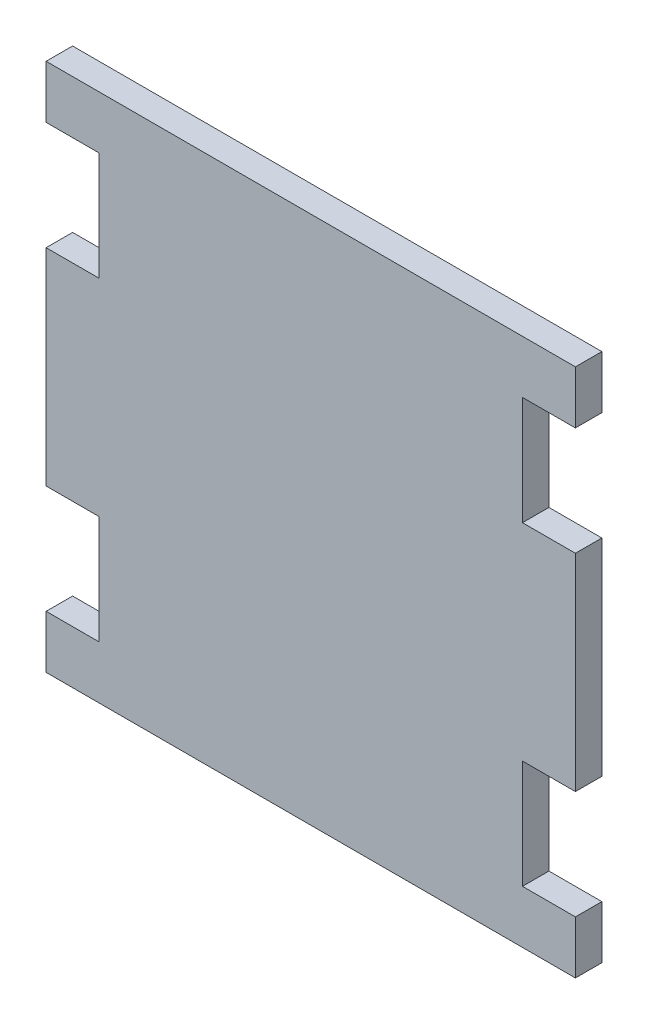
ISO-10303-21;
HEADER;
FILE_DESCRIPTION(('STEP AP214'),'2;1');
FILE_NAME('part.step','',(''),(''),'','','');
FILE_SCHEMA(('AUTOMOTIVE_DESIGN { 1 0 10303 214 1 1 1 1 }'));
ENDSEC;
DATA;
#1=APPLICATION_CONTEXT('core data for automotive mechanical design processes');
#2=APPLICATION_PROTOCOL_DEFINITION('international standard','automotive_design',2000,#1);
#3=PRODUCT_CONTEXT('',#1,'mechanical');
#4=PRODUCT('Part','Part','',(#3));
#5=PRODUCT_RELATED_PRODUCT_CATEGORY('part','',(#4));
#6=PRODUCT_DEFINITION_FORMATION('','',#4);
#7=PRODUCT_DEFINITION_CONTEXT('part definition',#1,'design');
#8=PRODUCT_DEFINITION('design','',#6,#7);
#9=PRODUCT_DEFINITION_SHAPE('','',#8);
#10=(LENGTH_UNIT() NAMED_UNIT(*) SI_UNIT(.MILLI.,.METRE.));
#11=(NAMED_UNIT(*) PLANE_ANGLE_UNIT() SI_UNIT($,.RADIAN.));
#12=(NAMED_UNIT(*) SI_UNIT($,.STERADIAN.) SOLID_ANGLE_UNIT());
#13=UNCERTAINTY_MEASURE_WITH_UNIT(LENGTH_MEASURE(1.E-05),#10,'distance_accuracy_value','');
#14=(GEOMETRIC_REPRESENTATION_CONTEXT(3) GLOBAL_UNCERTAINTY_ASSIGNED_CONTEXT((#13)) GLOBAL_UNIT_ASSIGNED_CONTEXT((#10,
#11,#12)) REPRESENTATION_CONTEXT('',''));
#15=CARTESIAN_POINT('',(0.,0.,0.));
#16=DIRECTION('',(0.,0.,1.));
#17=DIRECTION('',(1.,0.,0.));
#18=AXIS2_PLACEMENT_3D('',#15,#16,#17);
#19=CARTESIAN_POINT('',(200.,0.,10.));
#20=DIRECTION('',(-1.,0.,0.));
#21=DIRECTION('',(0.,-1.,0.));
#22=AXIS2_PLACEMENT_3D('',#19,#20,#21);
#23=PLANE('',#22);
#24=DIRECTION('',(0.,1.,0.));
#25=VECTOR('',#24,1.);
#26=CARTESIAN_POINT('',(200.,0.,0.));
#27=LINE('',#26,#25);
#28=CARTESIAN_POINT('',(200.,-200.,0.));
#29=VERTEX_POINT('',#28);
#30=CARTESIAN_POINT('',(200.,-180.,0.));
#31=VERTEX_POINT('',#30);
#32=EDGE_CURVE('E193',#29,#31,#27,.T.);
#33=ORIENTED_EDGE('',*,*,#32,.T.);
#34=DIRECTION('',(0.,0.,1.));
#35=VECTOR('',#34,1.);
#36=CARTESIAN_POINT('',(200.,-180.,0.));
#37=LINE('',#36,#35);
#38=CARTESIAN_POINT('',(200.,-180.,10.));
#39=VERTEX_POINT('',#38);
#40=EDGE_CURVE('E234',#31,#39,#37,.T.);
#41=ORIENTED_EDGE('',*,*,#40,.T.);
#42=DIRECTION('',(0.,1.,0.));
#43=VECTOR('',#42,1.);
#44=CARTESIAN_POINT('',(200.,0.,10.));
#45=LINE('',#44,#43);
#46=CARTESIAN_POINT('',(200.,-200.,10.));
#47=VERTEX_POINT('',#46);
#48=EDGE_CURVE('E217',#47,#39,#45,.T.);
#49=ORIENTED_EDGE('',*,*,#48,.F.);
#50=DIRECTION('',(0.,0.,-1.));
#51=VECTOR('',#50,1.);
#52=CARTESIAN_POINT('',(200.,-200.,10.));
#53=LINE('',#52,#51);
#54=EDGE_CURVE('E41',#47,#29,#53,.T.);
#55=ORIENTED_EDGE('',*,*,#54,.T.);
#56=EDGE_LOOP('',(#33,#41,#49,#55));
#57=FACE_BOUND('',#56,.T.);
#58=ADVANCED_FACE('F33',(#57),#23,.F.);
#59=CARTESIAN_POINT('',(200.,-139.,10.));
#60=VERTEX_POINT('',#59);
#61=CARTESIAN_POINT('',(200.,-61.,10.));
#62=VERTEX_POINT('',#61);
#63=EDGE_CURVE('E186',#60,#62,#45,.T.);
#64=ORIENTED_EDGE('',*,*,#63,.F.);
#65=DIRECTION('',(0.,0.,1.));
#66=VECTOR('',#65,1.);
#67=CARTESIAN_POINT('',(200.,-139.,0.));
#68=LINE('',#67,#66);
#69=CARTESIAN_POINT('',(200.,-139.,0.));
#70=VERTEX_POINT('',#69);
#71=EDGE_CURVE('E173',#70,#60,#68,.T.);
#72=ORIENTED_EDGE('',*,*,#71,.F.);
#73=CARTESIAN_POINT('',(200.,-61.,0.));
#74=VERTEX_POINT('',#73);
#75=EDGE_CURVE('E184',#70,#74,#27,.T.);
#76=ORIENTED_EDGE('',*,*,#75,.T.);
#77=DIRECTION('',(0.,0.,1.));
#78=VECTOR('',#77,1.);
#79=CARTESIAN_POINT('',(200.,-61.,0.));
#80=LINE('',#79,#78);
#81=EDGE_CURVE('E254',#74,#62,#80,.T.);
#82=ORIENTED_EDGE('',*,*,#81,.T.);
#83=EDGE_LOOP('',(#64,#72,#76,#82));
#84=FACE_BOUND('',#83,.T.);
#85=ADVANCED_FACE('F182',(#84),#23,.F.);
#86=CARTESIAN_POINT('',(0.,0.,10.));
#87=DIRECTION('',(1.,0.,0.));
#88=DIRECTION('',(0.,1.,0.));
#89=AXIS2_PLACEMENT_3D('',#86,#87,#88);
#90=PLANE('',#89);
#91=DIRECTION('',(0.,-1.,0.));
#92=VECTOR('',#91,1.);
#93=CARTESIAN_POINT('',(0.,0.,0.));
#94=LINE('',#93,#92);
#95=CARTESIAN_POINT('',(0.,-61.,0.));
#96=VERTEX_POINT('',#95);
#97=CARTESIAN_POINT('',(0.,-139.,0.));
#98=VERTEX_POINT('',#97);
#99=EDGE_CURVE('E324',#96,#98,#94,.T.);
#100=ORIENTED_EDGE('',*,*,#99,.T.);
#101=DIRECTION('',(0.,0.,1.));
#102=VECTOR('',#101,1.);
#103=CARTESIAN_POINT('',(0.,-139.,0.));
#104=LINE('',#103,#102);
#105=CARTESIAN_POINT('',(0.,-139.,10.));
#106=VERTEX_POINT('',#105);
#107=EDGE_CURVE('E279',#98,#106,#104,.T.);
#108=ORIENTED_EDGE('',*,*,#107,.T.);
#109=DIRECTION('',(0.,-1.,0.));
#110=VECTOR('',#109,1.);
#111=CARTESIAN_POINT('',(0.,0.,10.));
#112=LINE('',#111,#110);
#113=CARTESIAN_POINT('',(0.,-61.,10.));
#114=VERTEX_POINT('',#113);
#115=EDGE_CURVE('E318',#114,#106,#112,.T.);
#116=ORIENTED_EDGE('',*,*,#115,.F.);
#117=DIRECTION('',(0.,0.,1.));
#118=VECTOR('',#117,1.);
#119=CARTESIAN_POINT('',(0.,-61.,0.));
#120=LINE('',#119,#118);
#121=EDGE_CURVE('E298',#96,#114,#120,.T.);
#122=ORIENTED_EDGE('',*,*,#121,.F.);
#123=EDGE_LOOP('',(#100,#108,#116,#122));
#124=FACE_BOUND('',#123,.T.);
#125=ADVANCED_FACE('F346',(#124),#90,.F.);
#126=CARTESIAN_POINT('',(0.,0.,0.));
#127=VERTEX_POINT('',#126);
#128=CARTESIAN_POINT('',(0.,-20.,0.));
#129=VERTEX_POINT('',#128);
#130=EDGE_CURVE('E322',#127,#129,#94,.T.);
#131=ORIENTED_EDGE('',*,*,#130,.T.);
#132=DIRECTION('',(0.,0.,1.));
#133=VECTOR('',#132,1.);
#134=CARTESIAN_POINT('',(0.,-20.,0.));
#135=LINE('',#134,#133);
#136=CARTESIAN_POINT('',(0.,-20.,10.));
#137=VERTEX_POINT('',#136);
#138=EDGE_CURVE('E305',#129,#137,#135,.T.);
#139=ORIENTED_EDGE('',*,*,#138,.T.);
#140=CARTESIAN_POINT('',(0.,0.,10.));
#141=VERTEX_POINT('',#140);
#142=EDGE_CURVE('E314',#141,#137,#112,.T.);
#143=ORIENTED_EDGE('',*,*,#142,.F.);
#144=DIRECTION('',(0.,0.,-1.));
#145=VECTOR('',#144,1.);
#146=CARTESIAN_POINT('',(0.,0.,10.));
#147=LINE('',#146,#145);
#148=EDGE_CURVE('E204',#141,#127,#147,.T.);
#149=ORIENTED_EDGE('',*,*,#148,.T.);
#150=EDGE_LOOP('',(#131,#139,#143,#149));
#151=FACE_BOUND('',#150,.T.);
#152=ADVANCED_FACE('F365',(#151),#90,.F.);
#153=CARTESIAN_POINT('',(0.,-180.,10.));
#154=VERTEX_POINT('',#153);
#155=CARTESIAN_POINT('',(0.,-200.,10.));
#156=VERTEX_POINT('',#155);
#157=EDGE_CURVE('E203',#154,#156,#112,.T.);
#158=ORIENTED_EDGE('',*,*,#157,.F.);
#159=DIRECTION('',(0.,0.,1.));
#160=VECTOR('',#159,1.);
#161=CARTESIAN_POINT('',(0.,-180.,0.));
#162=LINE('',#161,#160);
#163=CARTESIAN_POINT('',(0.,-180.,0.));
#164=VERTEX_POINT('',#163);
#165=EDGE_CURVE('E272',#164,#154,#162,.T.);
#166=ORIENTED_EDGE('',*,*,#165,.F.);
#167=CARTESIAN_POINT('',(0.,-200.,0.));
#168=VERTEX_POINT('',#167);
#169=EDGE_CURVE('E308',#164,#168,#94,.T.);
#170=ORIENTED_EDGE('',*,*,#169,.T.);
#171=DIRECTION('',(0.,0.,-1.));
#172=VECTOR('',#171,1.);
#173=CARTESIAN_POINT('',(0.,-200.,10.));
#174=LINE('',#173,#172);
#175=EDGE_CURVE('E11',#156,#168,#174,.T.);
#176=ORIENTED_EDGE('',*,*,#175,.F.);
#177=EDGE_LOOP('',(#158,#166,#170,#176));
#178=FACE_BOUND('',#177,.T.);
#179=ADVANCED_FACE('F35',(#178),#90,.F.);
#180=CARTESIAN_POINT('',(0.,-200.,10.));
#181=DIRECTION('',(0.,1.,0.));
#182=DIRECTION('',(0.,0.,1.));
#183=AXIS2_PLACEMENT_3D('',#180,#181,#182);
#184=PLANE('',#183);
#185=DIRECTION('',(1.,0.,0.));
#186=VECTOR('',#185,1.);
#187=CARTESIAN_POINT('',(0.,-200.,0.));
#188=LINE('',#187,#186);
#189=EDGE_CURVE('E198',#168,#29,#188,.T.);
#190=ORIENTED_EDGE('',*,*,#189,.T.);
#191=ORIENTED_EDGE('',*,*,#54,.F.);
#192=DIRECTION('',(1.,0.,0.));
#193=VECTOR('',#192,1.);
#194=CARTESIAN_POINT('',(0.,-200.,10.));
#195=LINE('',#194,#193);
#196=EDGE_CURVE('E317',#156,#47,#195,.T.);
#197=ORIENTED_EDGE('',*,*,#196,.F.);
#198=ORIENTED_EDGE('',*,*,#175,.T.);
#199=EDGE_LOOP('',(#190,#191,#197,#198));
#200=FACE_BOUND('',#199,.T.);
#201=ADVANCED_FACE('F400',(#200),#184,.F.);
#202=CARTESIAN_POINT('',(200.,-20.,10.));
#203=VERTEX_POINT('',#202);
#204=CARTESIAN_POINT('',(200.,0.,10.));
#205=VERTEX_POINT('',#204);
#206=EDGE_CURVE('E320',#203,#205,#45,.T.);
#207=ORIENTED_EDGE('',*,*,#206,.F.);
#208=DIRECTION('',(0.,0.,1.));
#209=VECTOR('',#208,1.);
#210=CARTESIAN_POINT('',(200.,-20.,0.));
#211=LINE('',#210,#209);
#212=CARTESIAN_POINT('',(200.,-20.,0.));
#213=VERTEX_POINT('',#212);
#214=EDGE_CURVE('E246',#213,#203,#211,.T.);
#215=ORIENTED_EDGE('',*,*,#214,.F.);
#216=CARTESIAN_POINT('',(200.,0.,0.));
#217=VERTEX_POINT('',#216);
#218=EDGE_CURVE('E194',#213,#217,#27,.T.);
#219=ORIENTED_EDGE('',*,*,#218,.T.);
#220=DIRECTION('',(0.,0.,-1.));
#221=VECTOR('',#220,1.);
#222=CARTESIAN_POINT('',(200.,0.,10.));
#223=LINE('',#222,#221);
#224=EDGE_CURVE('E207',#205,#217,#223,.T.);
#225=ORIENTED_EDGE('',*,*,#224,.F.);
#226=EDGE_LOOP('',(#207,#215,#219,#225));
#227=FACE_BOUND('',#226,.T.);
#228=ADVANCED_FACE('F376',(#227),#23,.F.);
#229=CARTESIAN_POINT('',(0.,0.,10.));
#230=DIRECTION('',(0.,-1.,0.));
#231=DIRECTION('',(0.,0.,-1.));
#232=AXIS2_PLACEMENT_3D('',#229,#230,#231);
#233=PLANE('',#232);
#234=DIRECTION('',(-1.,0.,0.));
#235=VECTOR('',#234,1.);
#236=CARTESIAN_POINT('',(0.,0.,0.));
#237=LINE('',#236,#235);
#238=EDGE_CURVE('E197',#217,#127,#237,.T.);
#239=ORIENTED_EDGE('',*,*,#238,.T.);
#240=ORIENTED_EDGE('',*,*,#148,.F.);
#241=DIRECTION('',(-1.,0.,0.));
#242=VECTOR('',#241,1.);
#243=CARTESIAN_POINT('',(0.,0.,10.));
#244=LINE('',#243,#242);
#245=EDGE_CURVE('E208',#205,#141,#244,.T.);
#246=ORIENTED_EDGE('',*,*,#245,.F.);
#247=ORIENTED_EDGE('',*,*,#224,.T.);
#248=EDGE_LOOP('',(#239,#240,#246,#247));
#249=FACE_BOUND('',#248,.T.);
#250=ADVANCED_FACE('F372',(#249),#233,.F.);
#251=CARTESIAN_POINT('',(0.,0.,10.));
#252=DIRECTION('',(0.,0.,1.));
#253=DIRECTION('',(1.,0.,0.));
#254=AXIS2_PLACEMENT_3D('',#251,#252,#253);
#255=PLANE('',#254);
#256=DIRECTION('',(1.,0.,0.));
#257=VECTOR('',#256,1.);
#258=CARTESIAN_POINT('',(200.,-180.,10.));
#259=LINE('',#258,#257);
#260=CARTESIAN_POINT('',(180.,-180.,10.));
#261=VERTEX_POINT('',#260);
#262=EDGE_CURVE('E178',#261,#39,#259,.T.);
#263=ORIENTED_EDGE('',*,*,#262,.F.);
#264=DIRECTION('',(0.,-1.,0.));
#265=VECTOR('',#264,1.);
#266=CARTESIAN_POINT('',(180.,-139.,10.));
#267=LINE('',#266,#265);
#268=CARTESIAN_POINT('',(180.,-139.,10.));
#269=VERTEX_POINT('',#268);
#270=EDGE_CURVE('E230',#269,#261,#267,.T.);
#271=ORIENTED_EDGE('',*,*,#270,.F.);
#272=DIRECTION('',(-1.,0.,0.));
#273=VECTOR('',#272,1.);
#274=CARTESIAN_POINT('',(200.,-139.,10.));
#275=LINE('',#274,#273);
#276=EDGE_CURVE('E228',#60,#269,#275,.T.);
#277=ORIENTED_EDGE('',*,*,#276,.F.);
#278=ORIENTED_EDGE('',*,*,#63,.T.);
#279=DIRECTION('',(1.,0.,0.));
#280=VECTOR('',#279,1.);
#281=CARTESIAN_POINT('',(200.,-61.,10.));
#282=LINE('',#281,#280);
#283=CARTESIAN_POINT('',(180.,-61.,10.));
#284=VERTEX_POINT('',#283);
#285=EDGE_CURVE('E243',#284,#62,#282,.T.);
#286=ORIENTED_EDGE('',*,*,#285,.F.);
#287=DIRECTION('',(0.,-1.,0.));
#288=VECTOR('',#287,1.);
#289=CARTESIAN_POINT('',(180.,-20.,10.));
#290=LINE('',#289,#288);
#291=CARTESIAN_POINT('',(180.,-20.,10.));
#292=VERTEX_POINT('',#291);
#293=EDGE_CURVE('E249',#292,#284,#290,.T.);
#294=ORIENTED_EDGE('',*,*,#293,.F.);
#295=DIRECTION('',(-1.,0.,0.));
#296=VECTOR('',#295,1.);
#297=CARTESIAN_POINT('',(200.,-20.,10.));
#298=LINE('',#297,#296);
#299=EDGE_CURVE('E236',#203,#292,#298,.T.);
#300=ORIENTED_EDGE('',*,*,#299,.F.);
#301=ORIENTED_EDGE('',*,*,#206,.T.);
#302=ORIENTED_EDGE('',*,*,#245,.T.);
#303=ORIENTED_EDGE('',*,*,#142,.T.);
#304=DIRECTION('',(-1.,0.,0.));
#305=VECTOR('',#304,1.);
#306=CARTESIAN_POINT('',(0.,-20.,10.));
#307=LINE('',#306,#305);
#308=CARTESIAN_POINT('',(20.,-20.,10.));
#309=VERTEX_POINT('',#308);
#310=EDGE_CURVE('E292',#309,#137,#307,.T.);
#311=ORIENTED_EDGE('',*,*,#310,.F.);
#312=DIRECTION('',(0.,1.,0.));
#313=VECTOR('',#312,1.);
#314=CARTESIAN_POINT('',(20.,-20.,10.));
#315=LINE('',#314,#313);
#316=CARTESIAN_POINT('',(20.,-61.,10.));
#317=VERTEX_POINT('',#316);
#318=EDGE_CURVE('E301',#317,#309,#315,.T.);
#319=ORIENTED_EDGE('',*,*,#318,.F.);
#320=DIRECTION('',(1.,0.,0.));
#321=VECTOR('',#320,1.);
#322=CARTESIAN_POINT('',(0.,-61.,10.));
#323=LINE('',#322,#321);
#324=EDGE_CURVE('E282',#114,#317,#323,.T.);
#325=ORIENTED_EDGE('',*,*,#324,.F.);
#326=ORIENTED_EDGE('',*,*,#115,.T.);
#327=DIRECTION('',(-1.,0.,0.));
#328=VECTOR('',#327,1.);
#329=CARTESIAN_POINT('',(0.,-139.,10.));
#330=LINE('',#329,#328);
#331=CARTESIAN_POINT('',(20.,-139.,10.));
#332=VERTEX_POINT('',#331);
#333=EDGE_CURVE('E266',#332,#106,#330,.T.);
#334=ORIENTED_EDGE('',*,*,#333,.F.);
#335=DIRECTION('',(0.,1.,0.));
#336=VECTOR('',#335,1.);
#337=CARTESIAN_POINT('',(20.,-180.,10.));
#338=LINE('',#337,#336);
#339=CARTESIAN_POINT('',(20.,-180.,10.));
#340=VERTEX_POINT('',#339);
#341=EDGE_CURVE('E275',#340,#332,#338,.T.);
#342=ORIENTED_EDGE('',*,*,#341,.F.);
#343=DIRECTION('',(1.,0.,0.));
#344=VECTOR('',#343,1.);
#345=CARTESIAN_POINT('',(0.,-180.,10.));
#346=LINE('',#345,#344);
#347=EDGE_CURVE('E256',#154,#340,#346,.T.);
#348=ORIENTED_EDGE('',*,*,#347,.F.);
#349=ORIENTED_EDGE('',*,*,#157,.T.);
#350=ORIENTED_EDGE('',*,*,#196,.T.);
#351=ORIENTED_EDGE('',*,*,#48,.T.);
#352=EDGE_LOOP('',(#263,#271,#277,#278,#286,#294,#300,#301,#302,#303,#311,#319,#325,#326,#334,
#342,#348,#349,#350,#351));
#353=FACE_BOUND('',#352,.T.);
#354=ADVANCED_FACE('F356',(#353),#255,.T.);
#355=CARTESIAN_POINT('',(0.,0.,0.));
#356=DIRECTION('',(0.,0.,1.));
#357=DIRECTION('',(1.,0.,0.));
#358=AXIS2_PLACEMENT_3D('',#355,#356,#357);
#359=PLANE('',#358);
#360=DIRECTION('',(0.,-1.,0.));
#361=VECTOR('',#360,1.);
#362=CARTESIAN_POINT('',(180.,-139.,0.));
#363=LINE('',#362,#361);
#364=CARTESIAN_POINT('',(180.,-139.,0.));
#365=VERTEX_POINT('',#364);
#366=CARTESIAN_POINT('',(180.,-180.,0.));
#367=VERTEX_POINT('',#366);
#368=EDGE_CURVE('E48',#365,#367,#363,.T.);
#369=ORIENTED_EDGE('',*,*,#368,.T.);
#370=DIRECTION('',(1.,0.,0.));
#371=VECTOR('',#370,1.);
#372=CARTESIAN_POINT('',(200.,-180.,0.));
#373=LINE('',#372,#371);
#374=EDGE_CURVE('E187',#367,#31,#373,.T.);
#375=ORIENTED_EDGE('',*,*,#374,.T.);
#376=ORIENTED_EDGE('',*,*,#32,.F.);
#377=ORIENTED_EDGE('',*,*,#189,.F.);
#378=ORIENTED_EDGE('',*,*,#169,.F.);
#379=DIRECTION('',(1.,0.,0.));
#380=VECTOR('',#379,1.);
#381=CARTESIAN_POINT('',(0.,-180.,0.));
#382=LINE('',#381,#380);
#383=CARTESIAN_POINT('',(20.,-180.,0.));
#384=VERTEX_POINT('',#383);
#385=EDGE_CURVE('E262',#164,#384,#382,.T.);
#386=ORIENTED_EDGE('',*,*,#385,.T.);
#387=DIRECTION('',(0.,1.,0.));
#388=VECTOR('',#387,1.);
#389=CARTESIAN_POINT('',(20.,-180.,0.));
#390=LINE('',#389,#388);
#391=CARTESIAN_POINT('',(20.,-139.,0.));
#392=VERTEX_POINT('',#391);
#393=EDGE_CURVE('E265',#384,#392,#390,.T.);
#394=ORIENTED_EDGE('',*,*,#393,.T.);
#395=DIRECTION('',(-1.,0.,0.));
#396=VECTOR('',#395,1.);
#397=CARTESIAN_POINT('',(0.,-139.,0.));
#398=LINE('',#397,#396);
#399=EDGE_CURVE('E269',#392,#98,#398,.T.);
#400=ORIENTED_EDGE('',*,*,#399,.T.);
#401=ORIENTED_EDGE('',*,*,#99,.F.);
#402=DIRECTION('',(1.,0.,0.));
#403=VECTOR('',#402,1.);
#404=CARTESIAN_POINT('',(0.,-61.,0.));
#405=LINE('',#404,#403);
#406=CARTESIAN_POINT('',(20.,-61.,0.));
#407=VERTEX_POINT('',#406);
#408=EDGE_CURVE('E288',#96,#407,#405,.T.);
#409=ORIENTED_EDGE('',*,*,#408,.T.);
#410=DIRECTION('',(0.,1.,0.));
#411=VECTOR('',#410,1.);
#412=CARTESIAN_POINT('',(20.,-20.,0.));
#413=LINE('',#412,#411);
#414=CARTESIAN_POINT('',(20.,-20.,0.));
#415=VERTEX_POINT('',#414);
#416=EDGE_CURVE('E291',#407,#415,#413,.T.);
#417=ORIENTED_EDGE('',*,*,#416,.T.);
#418=DIRECTION('',(-1.,0.,0.));
#419=VECTOR('',#418,1.);
#420=CARTESIAN_POINT('',(0.,-20.,0.));
#421=LINE('',#420,#419);
#422=EDGE_CURVE('E295',#415,#129,#421,.T.);
#423=ORIENTED_EDGE('',*,*,#422,.T.);
#424=ORIENTED_EDGE('',*,*,#130,.F.);
#425=ORIENTED_EDGE('',*,*,#238,.F.);
#426=ORIENTED_EDGE('',*,*,#218,.F.);
#427=DIRECTION('',(-1.,0.,0.));
#428=VECTOR('',#427,1.);
#429=CARTESIAN_POINT('',(200.,-20.,0.));
#430=LINE('',#429,#428);
#431=CARTESIAN_POINT('',(180.,-20.,0.));
#432=VERTEX_POINT('',#431);
#433=EDGE_CURVE('E240',#213,#432,#430,.T.);
#434=ORIENTED_EDGE('',*,*,#433,.T.);
#435=DIRECTION('',(0.,-1.,0.));
#436=VECTOR('',#435,1.);
#437=CARTESIAN_POINT('',(180.,-20.,0.));
#438=LINE('',#437,#436);
#439=CARTESIAN_POINT('',(180.,-61.,0.));
#440=VERTEX_POINT('',#439);
#441=EDGE_CURVE('E56',#432,#440,#438,.T.);
#442=ORIENTED_EDGE('',*,*,#441,.T.);
#443=DIRECTION('',(1.,0.,0.));
#444=VECTOR('',#443,1.);
#445=CARTESIAN_POINT('',(200.,-61.,0.));
#446=LINE('',#445,#444);
#447=EDGE_CURVE('E192',#440,#74,#446,.T.);
#448=ORIENTED_EDGE('',*,*,#447,.T.);
#449=ORIENTED_EDGE('',*,*,#75,.F.);
#450=DIRECTION('',(-1.,0.,0.));
#451=VECTOR('',#450,1.);
#452=CARTESIAN_POINT('',(200.,-139.,0.));
#453=LINE('',#452,#451);
#454=EDGE_CURVE('E169',#70,#365,#453,.T.);
#455=ORIENTED_EDGE('',*,*,#454,.T.);
#456=EDGE_LOOP('',(#369,#375,#376,#377,#378,#386,#394,#400,#401,#409,#417,#423,#424,#425,#426,
#434,#442,#448,#449,#455));
#457=FACE_BOUND('',#456,.T.);
#458=ADVANCED_FACE('F190',(#457),#359,.F.);
#459=CARTESIAN_POINT('',(0.,-20.,0.));
#460=DIRECTION('',(0.,1.,0.));
#461=DIRECTION('',(0.,0.,1.));
#462=AXIS2_PLACEMENT_3D('',#459,#460,#461);
#463=PLANE('',#462);
#464=ORIENTED_EDGE('',*,*,#310,.T.);
#465=ORIENTED_EDGE('',*,*,#138,.F.);
#466=ORIENTED_EDGE('',*,*,#422,.F.);
#467=DIRECTION('',(0.,0.,1.));
#468=VECTOR('',#467,1.);
#469=CARTESIAN_POINT('',(20.,-20.,0.));
#470=LINE('',#469,#468);
#471=EDGE_CURVE('E309',#415,#309,#470,.T.);
#472=ORIENTED_EDGE('',*,*,#471,.T.);
#473=EDGE_LOOP('',(#464,#465,#466,#472));
#474=FACE_BOUND('',#473,.T.);
#475=ADVANCED_FACE('F363',(#474),#463,.F.);
#476=CARTESIAN_POINT('',(20.,-20.,0.));
#477=DIRECTION('',(1.,0.,0.));
#478=DIRECTION('',(0.,1.,0.));
#479=AXIS2_PLACEMENT_3D('',#476,#477,#478);
#480=PLANE('',#479);
#481=ORIENTED_EDGE('',*,*,#318,.T.);
#482=ORIENTED_EDGE('',*,*,#471,.F.);
#483=ORIENTED_EDGE('',*,*,#416,.F.);
#484=DIRECTION('',(0.,0.,1.));
#485=VECTOR('',#484,1.);
#486=CARTESIAN_POINT('',(20.,-61.,0.));
#487=LINE('',#486,#485);
#488=EDGE_CURVE('E311',#407,#317,#487,.T.);
#489=ORIENTED_EDGE('',*,*,#488,.T.);
#490=EDGE_LOOP('',(#481,#482,#483,#489));
#491=FACE_BOUND('',#490,.T.);
#492=ADVANCED_FACE('F359',(#491),#480,.F.);
#493=CARTESIAN_POINT('',(0.,-61.,0.));
#494=DIRECTION('',(0.,-1.,0.));
#495=DIRECTION('',(0.,0.,-1.));
#496=AXIS2_PLACEMENT_3D('',#493,#494,#495);
#497=PLANE('',#496);
#498=ORIENTED_EDGE('',*,*,#324,.T.);
#499=ORIENTED_EDGE('',*,*,#488,.F.);
#500=ORIENTED_EDGE('',*,*,#408,.F.);
#501=ORIENTED_EDGE('',*,*,#121,.T.);
#502=EDGE_LOOP('',(#498,#499,#500,#501));
#503=FACE_BOUND('',#502,.T.);
#504=ADVANCED_FACE('F351',(#503),#497,.F.);
#505=CARTESIAN_POINT('',(0.,-139.,0.));
#506=DIRECTION('',(0.,1.,0.));
#507=DIRECTION('',(0.,0.,1.));
#508=AXIS2_PLACEMENT_3D('',#505,#506,#507);
#509=PLANE('',#508);
#510=ORIENTED_EDGE('',*,*,#333,.T.);
#511=ORIENTED_EDGE('',*,*,#107,.F.);
#512=ORIENTED_EDGE('',*,*,#399,.F.);
#513=DIRECTION('',(0.,0.,1.));
#514=VECTOR('',#513,1.);
#515=CARTESIAN_POINT('',(20.,-139.,0.));
#516=LINE('',#515,#514);
#517=EDGE_CURVE('E283',#392,#332,#516,.T.);
#518=ORIENTED_EDGE('',*,*,#517,.T.);
#519=EDGE_LOOP('',(#510,#511,#512,#518));
#520=FACE_BOUND('',#519,.T.);
#521=ADVANCED_FACE('F342',(#520),#509,.F.);
#522=CARTESIAN_POINT('',(20.,-180.,0.));
#523=DIRECTION('',(1.,0.,0.));
#524=DIRECTION('',(0.,0.,-1.));
#525=AXIS2_PLACEMENT_3D('',#522,#523,#524);
#526=PLANE('',#525);
#527=ORIENTED_EDGE('',*,*,#341,.T.);
#528=ORIENTED_EDGE('',*,*,#517,.F.);
#529=ORIENTED_EDGE('',*,*,#393,.F.);
#530=DIRECTION('',(0.,0.,1.));
#531=VECTOR('',#530,1.);
#532=CARTESIAN_POINT('',(20.,-180.,0.));
#533=LINE('',#532,#531);
#534=EDGE_CURVE('E285',#384,#340,#533,.T.);
#535=ORIENTED_EDGE('',*,*,#534,.T.);
#536=EDGE_LOOP('',(#527,#528,#529,#535));
#537=FACE_BOUND('',#536,.T.);
#538=ADVANCED_FACE('F338',(#537),#526,.F.);
#539=CARTESIAN_POINT('',(0.,-180.,0.));
#540=DIRECTION('',(0.,-1.,0.));
#541=DIRECTION('',(0.,0.,-1.));
#542=AXIS2_PLACEMENT_3D('',#539,#540,#541);
#543=PLANE('',#542);
#544=ORIENTED_EDGE('',*,*,#347,.T.);
#545=ORIENTED_EDGE('',*,*,#534,.F.);
#546=ORIENTED_EDGE('',*,*,#385,.F.);
#547=ORIENTED_EDGE('',*,*,#165,.T.);
#548=EDGE_LOOP('',(#544,#545,#546,#547));
#549=FACE_BOUND('',#548,.T.);
#550=ADVANCED_FACE('F334',(#549),#543,.F.);
#551=CARTESIAN_POINT('',(200.,-61.,0.));
#552=DIRECTION('',(0.,-1.,0.));
#553=DIRECTION('',(1.,0.,0.));
#554=AXIS2_PLACEMENT_3D('',#551,#552,#553);
#555=PLANE('',#554);
#556=ORIENTED_EDGE('',*,*,#285,.T.);
#557=ORIENTED_EDGE('',*,*,#81,.F.);
#558=ORIENTED_EDGE('',*,*,#447,.F.);
#559=DIRECTION('',(0.,0.,1.));
#560=VECTOR('',#559,1.);
#561=CARTESIAN_POINT('',(180.,-61.,0.));
#562=LINE('',#561,#560);
#563=EDGE_CURVE('E257',#440,#284,#562,.T.);
#564=ORIENTED_EDGE('',*,*,#563,.T.);
#565=EDGE_LOOP('',(#556,#557,#558,#564));
#566=FACE_BOUND('',#565,.T.);
#567=ADVANCED_FACE('F383',(#566),#555,.F.);
#568=CARTESIAN_POINT('',(180.,-20.,0.));
#569=DIRECTION('',(-1.,0.,0.));
#570=DIRECTION('',(0.,0.,1.));
#571=AXIS2_PLACEMENT_3D('',#568,#569,#570);
#572=PLANE('',#571);
#573=ORIENTED_EDGE('',*,*,#293,.T.);
#574=ORIENTED_EDGE('',*,*,#563,.F.);
#575=ORIENTED_EDGE('',*,*,#441,.F.);
#576=DIRECTION('',(0.,0.,1.));
#577=VECTOR('',#576,1.);
#578=CARTESIAN_POINT('',(180.,-20.,0.));
#579=LINE('',#578,#577);
#580=EDGE_CURVE('E259',#432,#292,#579,.T.);
#581=ORIENTED_EDGE('',*,*,#580,.T.);
#582=EDGE_LOOP('',(#573,#574,#575,#581));
#583=FACE_BOUND('',#582,.T.);
#584=ADVANCED_FACE('F381',(#583),#572,.F.);
#585=CARTESIAN_POINT('',(200.,-20.,0.));
#586=DIRECTION('',(0.,1.,0.));
#587=DIRECTION('',(-1.,0.,0.));
#588=AXIS2_PLACEMENT_3D('',#585,#586,#587);
#589=PLANE('',#588);
#590=ORIENTED_EDGE('',*,*,#299,.T.);
#591=ORIENTED_EDGE('',*,*,#580,.F.);
#592=ORIENTED_EDGE('',*,*,#433,.F.);
#593=ORIENTED_EDGE('',*,*,#214,.T.);
#594=EDGE_LOOP('',(#590,#591,#592,#593));
#595=FACE_BOUND('',#594,.T.);
#596=ADVANCED_FACE('F378',(#595),#589,.F.);
#597=CARTESIAN_POINT('',(200.,-180.,0.));
#598=DIRECTION('',(0.,-1.,0.));
#599=DIRECTION('',(0.,0.,-1.));
#600=AXIS2_PLACEMENT_3D('',#597,#598,#599);
#601=PLANE('',#600);
#602=ORIENTED_EDGE('',*,*,#262,.T.);
#603=ORIENTED_EDGE('',*,*,#40,.F.);
#604=ORIENTED_EDGE('',*,*,#374,.F.);
#605=DIRECTION('',(0.,0.,1.));
#606=VECTOR('',#605,1.);
#607=CARTESIAN_POINT('',(180.,-180.,0.));
#608=LINE('',#607,#606);
#609=EDGE_CURVE('E237',#367,#261,#608,.T.);
#610=ORIENTED_EDGE('',*,*,#609,.T.);
#611=EDGE_LOOP('',(#602,#603,#604,#610));
#612=FACE_BOUND('',#611,.T.);
#613=ADVANCED_FACE('F409',(#612),#601,.F.);
#614=CARTESIAN_POINT('',(180.,-139.,0.));
#615=DIRECTION('',(-1.,0.,0.));
#616=DIRECTION('',(0.,0.,1.));
#617=AXIS2_PLACEMENT_3D('',#614,#615,#616);
#618=PLANE('',#617);
#619=ORIENTED_EDGE('',*,*,#270,.T.);
#620=ORIENTED_EDGE('',*,*,#609,.F.);
#621=ORIENTED_EDGE('',*,*,#368,.F.);
#622=DIRECTION('',(0.,0.,1.));
#623=VECTOR('',#622,1.);
#624=CARTESIAN_POINT('',(180.,-139.,0.));
#625=LINE('',#624,#623);
#626=EDGE_CURVE('E175',#365,#269,#625,.T.);
#627=ORIENTED_EDGE('',*,*,#626,.T.);
#628=EDGE_LOOP('',(#619,#620,#621,#627));
#629=FACE_BOUND('',#628,.T.);
#630=ADVANCED_FACE('F410',(#629),#618,.F.);
#631=CARTESIAN_POINT('',(200.,-139.,0.));
#632=DIRECTION('',(0.,1.,0.));
#633=DIRECTION('',(0.,0.,1.));
#634=AXIS2_PLACEMENT_3D('',#631,#632,#633);
#635=PLANE('',#634);
#636=ORIENTED_EDGE('',*,*,#276,.T.);
#637=ORIENTED_EDGE('',*,*,#626,.F.);
#638=ORIENTED_EDGE('',*,*,#454,.F.);
#639=ORIENTED_EDGE('',*,*,#71,.T.);
#640=EDGE_LOOP('',(#636,#637,#638,#639));
#641=FACE_BOUND('',#640,.T.);
#642=ADVANCED_FACE('F172',(#641),#635,.F.);
#643=CLOSED_SHELL('',(#58,#85,#125,#152,#179,#201,#228,#250,#354,#458,#475,#492,#504,#521,#538,
#550,#567,#584,#596,#613,#630,#642));
#644=MANIFOLD_SOLID_BREP('B2',#643);
#645=ADVANCED_BREP_SHAPE_REPRESENTATION('',(#18,#644),#14);
#646=SHAPE_DEFINITION_REPRESENTATION(#9,#645);
ENDSEC;
END-ISO-10303-21;
